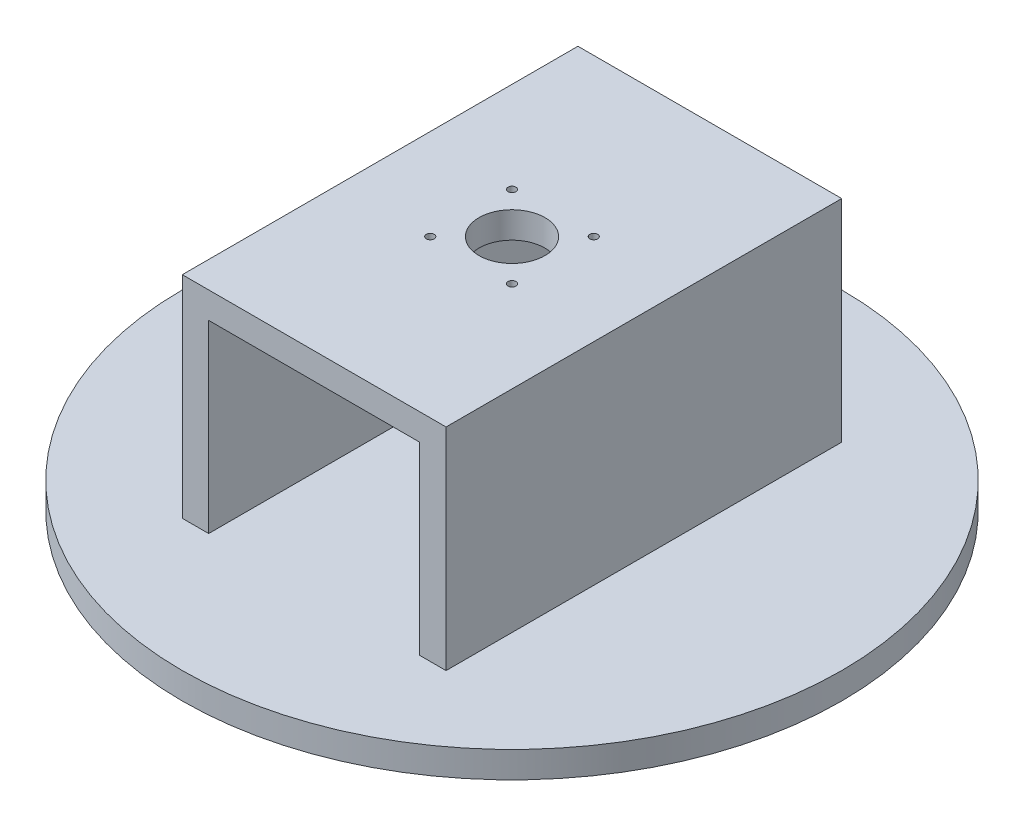
ISO-10303-21;
HEADER;
FILE_DESCRIPTION(('STEP AP214'),'2;1');
FILE_NAME('part.step','',(''),(''),'','','');
FILE_SCHEMA(('AUTOMOTIVE_DESIGN { 1 0 10303 214 1 1 1 1 }'));
ENDSEC;
DATA;
#1=APPLICATION_CONTEXT('core data for automotive mechanical design processes');
#2=APPLICATION_PROTOCOL_DEFINITION('international standard','automotive_design',2000,#1);
#3=PRODUCT_CONTEXT('',#1,'mechanical');
#4=PRODUCT('Part','Part','',(#3));
#5=PRODUCT_RELATED_PRODUCT_CATEGORY('part','',(#4));
#6=PRODUCT_DEFINITION_FORMATION('','',#4);
#7=PRODUCT_DEFINITION_CONTEXT('part definition',#1,'design');
#8=PRODUCT_DEFINITION('design','',#6,#7);
#9=PRODUCT_DEFINITION_SHAPE('','',#8);
#10=(LENGTH_UNIT() NAMED_UNIT(*) SI_UNIT(.MILLI.,.METRE.));
#11=(NAMED_UNIT(*) PLANE_ANGLE_UNIT() SI_UNIT($,.RADIAN.));
#12=(NAMED_UNIT(*) SI_UNIT($,.STERADIAN.) SOLID_ANGLE_UNIT());
#13=UNCERTAINTY_MEASURE_WITH_UNIT(LENGTH_MEASURE(1.E-05),#10,'distance_accuracy_value','');
#14=(GEOMETRIC_REPRESENTATION_CONTEXT(3) GLOBAL_UNCERTAINTY_ASSIGNED_CONTEXT((#13)) GLOBAL_UNIT_ASSIGNED_CONTEXT((#10,
#11,#12)) REPRESENTATION_CONTEXT('',''));
#15=CARTESIAN_POINT('',(0.,0.,0.));
#16=DIRECTION('',(0.,0.,1.));
#17=DIRECTION('',(1.,0.,0.));
#18=AXIS2_PLACEMENT_3D('',#15,#16,#17);
#19=CARTESIAN_POINT('',(0.,10.,0.));
#20=DIRECTION('',(0.,-1.,0.));
#21=DIRECTION('',(0.,0.,-1.));
#22=AXIS2_PLACEMENT_3D('',#19,#20,#21);
#23=CYLINDRICAL_SURFACE('',#22,125.);
#24=CARTESIAN_POINT('',(0.,10.,0.));
#25=DIRECTION('',(0.,1.,0.));
#26=DIRECTION('',(0.,0.,1.));
#27=AXIS2_PLACEMENT_3D('',#24,#25,#26);
#28=CIRCLE('',#27,125.);
#29=CARTESIAN_POINT('',(0.,10.,125.));
#30=VERTEX_POINT('',#29);
#31=EDGE_CURVE('E11',#30,#30,#28,.T.);
#32=ORIENTED_EDGE('',*,*,#31,.F.);
#33=EDGE_LOOP('',(#32));
#34=FACE_BOUND('',#33,.T.);
#35=CARTESIAN_POINT('',(0.,0.,0.));
#36=DIRECTION('',(0.,1.,0.));
#37=DIRECTION('',(0.,0.,1.));
#38=AXIS2_PLACEMENT_3D('',#35,#36,#37);
#39=CIRCLE('',#38,125.);
#40=CARTESIAN_POINT('',(0.,0.,125.));
#41=VERTEX_POINT('',#40);
#42=EDGE_CURVE('E41',#41,#41,#39,.T.);
#43=ORIENTED_EDGE('',*,*,#42,.T.);
#44=EDGE_LOOP('',(#43));
#45=FACE_BOUND('',#44,.T.);
#46=ADVANCED_FACE('F38',(#34,#45),#23,.T.);
#47=CARTESIAN_POINT('',(0.,10.,0.));
#48=DIRECTION('',(0.,1.,0.));
#49=DIRECTION('',(0.,0.,1.));
#50=AXIS2_PLACEMENT_3D('',#47,#48,#49);
#51=PLANE('',#50);
#52=DIRECTION('',(1.,0.,0.));
#53=VECTOR('',#52,1.);
#54=CARTESIAN_POINT('',(0.,10.,-75.));
#55=LINE('',#54,#53);
#56=CARTESIAN_POINT('',(40.,10.,-75.));
#57=VERTEX_POINT('',#56);
#58=CARTESIAN_POINT('',(50.,10.,-75.));
#59=VERTEX_POINT('',#58);
#60=EDGE_CURVE('E138',#57,#59,#55,.T.);
#61=ORIENTED_EDGE('',*,*,#60,.T.);
#62=DIRECTION('',(0.,0.,1.));
#63=VECTOR('',#62,1.);
#64=CARTESIAN_POINT('',(50.,10.,0.));
#65=LINE('',#64,#63);
#66=CARTESIAN_POINT('',(50.,10.,75.));
#67=VERTEX_POINT('',#66);
#68=EDGE_CURVE('E146',#59,#67,#65,.T.);
#69=ORIENTED_EDGE('',*,*,#68,.T.);
#70=DIRECTION('',(1.,0.,0.));
#71=VECTOR('',#70,1.);
#72=CARTESIAN_POINT('',(0.,10.,75.));
#73=LINE('',#72,#71);
#74=CARTESIAN_POINT('',(40.,10.,75.));
#75=VERTEX_POINT('',#74);
#76=EDGE_CURVE('E57',#75,#67,#73,.T.);
#77=ORIENTED_EDGE('',*,*,#76,.F.);
#78=DIRECTION('',(0.,0.,1.));
#79=VECTOR('',#78,1.);
#80=CARTESIAN_POINT('',(40.,10.,0.));
#81=LINE('',#80,#79);
#82=EDGE_CURVE('E52',#57,#75,#81,.T.);
#83=ORIENTED_EDGE('',*,*,#82,.F.);
#84=EDGE_LOOP('',(#61,#69,#77,#83));
#85=FACE_BOUND('',#84,.T.);
#86=DIRECTION('',(0.,0.,1.));
#87=VECTOR('',#86,1.);
#88=CARTESIAN_POINT('',(-40.,10.,0.));
#89=LINE('',#88,#87);
#90=CARTESIAN_POINT('',(-40.,10.,-75.));
#91=VERTEX_POINT('',#90);
#92=CARTESIAN_POINT('',(-40.,10.,75.));
#93=VERTEX_POINT('',#92);
#94=EDGE_CURVE('E159',#91,#93,#89,.T.);
#95=ORIENTED_EDGE('',*,*,#94,.T.);
#96=DIRECTION('',(1.,0.,0.));
#97=VECTOR('',#96,1.);
#98=CARTESIAN_POINT('',(0.,10.,75.));
#99=LINE('',#98,#97);
#100=CARTESIAN_POINT('',(-50.,10.,75.));
#101=VERTEX_POINT('',#100);
#102=EDGE_CURVE('E163',#101,#93,#99,.T.);
#103=ORIENTED_EDGE('',*,*,#102,.F.);
#104=DIRECTION('',(0.,0.,1.));
#105=VECTOR('',#104,1.);
#106=CARTESIAN_POINT('',(-50.,10.,0.));
#107=LINE('',#106,#105);
#108=CARTESIAN_POINT('',(-50.,10.,-75.));
#109=VERTEX_POINT('',#108);
#110=EDGE_CURVE('E106',#109,#101,#107,.T.);
#111=ORIENTED_EDGE('',*,*,#110,.F.);
#112=DIRECTION('',(1.,0.,0.));
#113=VECTOR('',#112,1.);
#114=CARTESIAN_POINT('',(0.,10.,-75.));
#115=LINE('',#114,#113);
#116=EDGE_CURVE('E166',#109,#91,#115,.T.);
#117=ORIENTED_EDGE('',*,*,#116,.T.);
#118=EDGE_LOOP('',(#95,#103,#111,#117));
#119=FACE_BOUND('',#118,.T.);
#120=ORIENTED_EDGE('',*,*,#31,.T.);
#121=EDGE_LOOP('',(#120));
#122=FACE_BOUND('',#121,.T.);
#123=ADVANCED_FACE('F185',(#85,#119,#122),#51,.T.);
#124=CARTESIAN_POINT('',(0.,0.,0.));
#125=DIRECTION('',(0.,1.,0.));
#126=DIRECTION('',(0.,0.,1.));
#127=AXIS2_PLACEMENT_3D('',#124,#125,#126);
#128=PLANE('',#127);
#129=ORIENTED_EDGE('',*,*,#42,.F.);
#130=EDGE_LOOP('',(#129));
#131=FACE_BOUND('',#130,.T.);
#132=ADVANCED_FACE('F182',(#131),#128,.F.);
#133=CARTESIAN_POINT('',(-40.,80.,0.));
#134=DIRECTION('',(1.,0.,0.));
#135=DIRECTION('',(0.,0.,-1.));
#136=AXIS2_PLACEMENT_3D('',#133,#134,#135);
#137=PLANE('',#136);
#138=ORIENTED_EDGE('',*,*,#94,.F.);
#139=DIRECTION('',(0.,-1.,0.));
#140=VECTOR('',#139,1.);
#141=CARTESIAN_POINT('',(-40.,80.,-75.));
#142=LINE('',#141,#140);
#143=CARTESIAN_POINT('',(-40.,80.,-75.));
#144=VERTEX_POINT('',#143);
#145=EDGE_CURVE('E173',#144,#91,#142,.T.);
#146=ORIENTED_EDGE('',*,*,#145,.F.);
#147=DIRECTION('',(0.,0.,1.));
#148=VECTOR('',#147,1.);
#149=CARTESIAN_POINT('',(-40.,80.,0.));
#150=LINE('',#149,#148);
#151=CARTESIAN_POINT('',(-40.,80.,75.));
#152=VERTEX_POINT('',#151);
#153=EDGE_CURVE('E160',#144,#152,#150,.T.);
#154=ORIENTED_EDGE('',*,*,#153,.T.);
#155=DIRECTION('',(0.,-1.,0.));
#156=VECTOR('',#155,1.);
#157=CARTESIAN_POINT('',(-40.,80.,75.));
#158=LINE('',#157,#156);
#159=EDGE_CURVE('E111',#152,#93,#158,.T.);
#160=ORIENTED_EDGE('',*,*,#159,.T.);
#161=EDGE_LOOP('',(#138,#146,#154,#160));
#162=FACE_BOUND('',#161,.T.);
#163=ADVANCED_FACE('F184',(#162),#137,.T.);
#164=CARTESIAN_POINT('',(0.,80.,-75.));
#165=DIRECTION('',(0.,0.,-1.));
#166=DIRECTION('',(-1.,0.,0.));
#167=AXIS2_PLACEMENT_3D('',#164,#165,#166);
#168=PLANE('',#167);
#169=ORIENTED_EDGE('',*,*,#116,.F.);
#170=DIRECTION('',(0.,-1.,0.));
#171=VECTOR('',#170,1.);
#172=CARTESIAN_POINT('',(-50.,80.,-75.));
#173=LINE('',#172,#171);
#174=CARTESIAN_POINT('',(-50.,90.,-75.));
#175=VERTEX_POINT('',#174);
#176=EDGE_CURVE('E110',#175,#109,#173,.T.);
#177=ORIENTED_EDGE('',*,*,#176,.F.);
#178=DIRECTION('',(-1.,0.,0.));
#179=VECTOR('',#178,1.);
#180=CARTESIAN_POINT('',(-50.,90.,-75.));
#181=LINE('',#180,#179);
#182=CARTESIAN_POINT('',(50.,90.,-75.));
#183=VERTEX_POINT('',#182);
#184=EDGE_CURVE('E126',#183,#175,#181,.T.);
#185=ORIENTED_EDGE('',*,*,#184,.F.);
#186=DIRECTION('',(0.,-1.,0.));
#187=VECTOR('',#186,1.);
#188=CARTESIAN_POINT('',(50.,80.,-75.));
#189=LINE('',#188,#187);
#190=EDGE_CURVE('E145',#183,#59,#189,.T.);
#191=ORIENTED_EDGE('',*,*,#190,.T.);
#192=ORIENTED_EDGE('',*,*,#60,.F.);
#193=DIRECTION('',(0.,-1.,0.));
#194=VECTOR('',#193,1.);
#195=CARTESIAN_POINT('',(40.,80.,-75.));
#196=LINE('',#195,#194);
#197=CARTESIAN_POINT('',(40.,80.,-75.));
#198=VERTEX_POINT('',#197);
#199=EDGE_CURVE('E157',#198,#57,#196,.T.);
#200=ORIENTED_EDGE('',*,*,#199,.F.);
#201=DIRECTION('',(-1.,0.,0.));
#202=VECTOR('',#201,1.);
#203=CARTESIAN_POINT('',(-50.,80.,-75.));
#204=LINE('',#203,#202);
#205=EDGE_CURVE('E127',#198,#144,#204,.T.);
#206=ORIENTED_EDGE('',*,*,#205,.T.);
#207=ORIENTED_EDGE('',*,*,#145,.T.);
#208=EDGE_LOOP('',(#169,#177,#185,#191,#192,#200,#206,#207));
#209=FACE_BOUND('',#208,.T.);
#210=ADVANCED_FACE('F190',(#209),#168,.T.);
#211=CARTESIAN_POINT('',(-50.,80.,0.));
#212=DIRECTION('',(1.,0.,0.));
#213=DIRECTION('',(0.,0.,-1.));
#214=AXIS2_PLACEMENT_3D('',#211,#212,#213);
#215=PLANE('',#214);
#216=ORIENTED_EDGE('',*,*,#110,.T.);
#217=DIRECTION('',(0.,-1.,0.));
#218=VECTOR('',#217,1.);
#219=CARTESIAN_POINT('',(-50.,80.,75.));
#220=LINE('',#219,#218);
#221=CARTESIAN_POINT('',(-50.,90.,75.));
#222=VERTEX_POINT('',#221);
#223=EDGE_CURVE('E100',#222,#101,#220,.T.);
#224=ORIENTED_EDGE('',*,*,#223,.F.);
#225=DIRECTION('',(0.,0.,1.));
#226=VECTOR('',#225,1.);
#227=CARTESIAN_POINT('',(-50.,90.,-75.));
#228=LINE('',#227,#226);
#229=EDGE_CURVE('E104',#175,#222,#228,.T.);
#230=ORIENTED_EDGE('',*,*,#229,.F.);
#231=ORIENTED_EDGE('',*,*,#176,.T.);
#232=EDGE_LOOP('',(#216,#224,#230,#231));
#233=FACE_BOUND('',#232,.T.);
#234=ADVANCED_FACE('F102',(#233),#215,.F.);
#235=CARTESIAN_POINT('',(0.,80.,75.));
#236=DIRECTION('',(0.,0.,-1.));
#237=DIRECTION('',(-1.,0.,0.));
#238=AXIS2_PLACEMENT_3D('',#235,#236,#237);
#239=PLANE('',#238);
#240=ORIENTED_EDGE('',*,*,#102,.T.);
#241=ORIENTED_EDGE('',*,*,#159,.F.);
#242=DIRECTION('',(1.,0.,0.));
#243=VECTOR('',#242,1.);
#244=CARTESIAN_POINT('',(-50.,80.,75.));
#245=LINE('',#244,#243);
#246=CARTESIAN_POINT('',(40.,80.,75.));
#247=VERTEX_POINT('',#246);
#248=EDGE_CURVE('E130',#152,#247,#245,.T.);
#249=ORIENTED_EDGE('',*,*,#248,.T.);
#250=DIRECTION('',(0.,-1.,0.));
#251=VECTOR('',#250,1.);
#252=CARTESIAN_POINT('',(40.,80.,75.));
#253=LINE('',#252,#251);
#254=EDGE_CURVE('E154',#247,#75,#253,.T.);
#255=ORIENTED_EDGE('',*,*,#254,.T.);
#256=ORIENTED_EDGE('',*,*,#76,.T.);
#257=DIRECTION('',(0.,-1.,0.));
#258=VECTOR('',#257,1.);
#259=CARTESIAN_POINT('',(50.,80.,75.));
#260=LINE('',#259,#258);
#261=CARTESIAN_POINT('',(50.,90.,75.));
#262=VERTEX_POINT('',#261);
#263=EDGE_CURVE('E117',#262,#67,#260,.T.);
#264=ORIENTED_EDGE('',*,*,#263,.F.);
#265=DIRECTION('',(1.,0.,0.));
#266=VECTOR('',#265,1.);
#267=CARTESIAN_POINT('',(-50.,90.,75.));
#268=LINE('',#267,#266);
#269=EDGE_CURVE('E114',#222,#262,#268,.T.);
#270=ORIENTED_EDGE('',*,*,#269,.F.);
#271=ORIENTED_EDGE('',*,*,#223,.T.);
#272=EDGE_LOOP('',(#240,#241,#249,#255,#256,#264,#270,#271));
#273=FACE_BOUND('',#272,.T.);
#274=ADVANCED_FACE('F115',(#273),#239,.F.);
#275=CARTESIAN_POINT('',(40.,80.,0.));
#276=DIRECTION('',(1.,0.,0.));
#277=DIRECTION('',(0.,0.,-1.));
#278=AXIS2_PLACEMENT_3D('',#275,#276,#277);
#279=PLANE('',#278);
#280=ORIENTED_EDGE('',*,*,#82,.T.);
#281=ORIENTED_EDGE('',*,*,#254,.F.);
#282=DIRECTION('',(0.,0.,1.));
#283=VECTOR('',#282,1.);
#284=CARTESIAN_POINT('',(40.,80.,0.));
#285=LINE('',#284,#283);
#286=EDGE_CURVE('E142',#198,#247,#285,.T.);
#287=ORIENTED_EDGE('',*,*,#286,.F.);
#288=ORIENTED_EDGE('',*,*,#199,.T.);
#289=EDGE_LOOP('',(#280,#281,#287,#288));
#290=FACE_BOUND('',#289,.T.);
#291=ADVANCED_FACE('F215',(#290),#279,.F.);
#292=CARTESIAN_POINT('',(50.,80.,0.));
#293=DIRECTION('',(1.,0.,0.));
#294=DIRECTION('',(0.,0.,-1.));
#295=AXIS2_PLACEMENT_3D('',#292,#293,#294);
#296=PLANE('',#295);
#297=ORIENTED_EDGE('',*,*,#68,.F.);
#298=ORIENTED_EDGE('',*,*,#190,.F.);
#299=DIRECTION('',(0.,0.,-1.));
#300=VECTOR('',#299,1.);
#301=CARTESIAN_POINT('',(50.,90.,-75.));
#302=LINE('',#301,#300);
#303=EDGE_CURVE('E121',#262,#183,#302,.T.);
#304=ORIENTED_EDGE('',*,*,#303,.F.);
#305=ORIENTED_EDGE('',*,*,#263,.T.);
#306=EDGE_LOOP('',(#297,#298,#304,#305));
#307=FACE_BOUND('',#306,.T.);
#308=ADVANCED_FACE('F239',(#307),#296,.T.);
#309=CARTESIAN_POINT('',(0.,80.,0.));
#310=DIRECTION('',(0.,1.,0.));
#311=DIRECTION('',(0.,0.,1.));
#312=AXIS2_PLACEMENT_3D('',#309,#310,#311);
#313=PLANE('',#312);
#314=CARTESIAN_POINT('',(15.5,80.,-15.5));
#315=DIRECTION('',(0.,1.,0.));
#316=DIRECTION('',(0.,0.,1.));
#317=AXIS2_PLACEMENT_3D('',#314,#315,#316);
#318=CIRCLE('',#317,1.5);
#319=CARTESIAN_POINT('',(15.5,80.,-14.));
#320=VERTEX_POINT('',#319);
#321=EDGE_CURVE('E379',#320,#320,#318,.T.);
#322=ORIENTED_EDGE('',*,*,#321,.T.);
#323=EDGE_LOOP('',(#322));
#324=FACE_BOUND('',#323,.T.);
#325=CARTESIAN_POINT('',(-15.5,80.,15.5));
#326=DIRECTION('',(0.,1.,0.));
#327=DIRECTION('',(0.,0.,1.));
#328=AXIS2_PLACEMENT_3D('',#325,#326,#327);
#329=CIRCLE('',#328,1.5);
#330=CARTESIAN_POINT('',(-15.5,80.,17.));
#331=VERTEX_POINT('',#330);
#332=EDGE_CURVE('E383',#331,#331,#329,.T.);
#333=ORIENTED_EDGE('',*,*,#332,.T.);
#334=EDGE_LOOP('',(#333));
#335=FACE_BOUND('',#334,.T.);
#336=CARTESIAN_POINT('',(15.5,80.,15.5));
#337=DIRECTION('',(0.,1.,0.));
#338=DIRECTION('',(0.,0.,1.));
#339=AXIS2_PLACEMENT_3D('',#336,#337,#338);
#340=CIRCLE('',#339,1.5);
#341=CARTESIAN_POINT('',(15.5,80.,17.));
#342=VERTEX_POINT('',#341);
#343=EDGE_CURVE('E392',#342,#342,#340,.T.);
#344=ORIENTED_EDGE('',*,*,#343,.T.);
#345=EDGE_LOOP('',(#344));
#346=FACE_BOUND('',#345,.T.);
#347=CARTESIAN_POINT('',(0.,80.,0.));
#348=DIRECTION('',(0.,1.,0.));
#349=DIRECTION('',(0.,0.,1.));
#350=AXIS2_PLACEMENT_3D('',#347,#348,#349);
#351=CIRCLE('',#350,12.5);
#352=CARTESIAN_POINT('',(0.,80.,12.5));
#353=VERTEX_POINT('',#352);
#354=EDGE_CURVE('E408',#353,#353,#351,.T.);
#355=ORIENTED_EDGE('',*,*,#354,.T.);
#356=EDGE_LOOP('',(#355));
#357=FACE_BOUND('',#356,.T.);
#358=CARTESIAN_POINT('',(-15.5,80.,-15.5));
#359=DIRECTION('',(0.,1.,0.));
#360=DIRECTION('',(0.,0.,1.));
#361=AXIS2_PLACEMENT_3D('',#358,#359,#360);
#362=CIRCLE('',#361,1.5);
#363=CARTESIAN_POINT('',(-15.5,80.,-14.));
#364=VERTEX_POINT('',#363);
#365=EDGE_CURVE('E140',#364,#364,#362,.T.);
#366=ORIENTED_EDGE('',*,*,#365,.T.);
#367=EDGE_LOOP('',(#366));
#368=FACE_BOUND('',#367,.T.);
#369=ORIENTED_EDGE('',*,*,#153,.F.);
#370=ORIENTED_EDGE('',*,*,#205,.F.);
#371=ORIENTED_EDGE('',*,*,#286,.T.);
#372=ORIENTED_EDGE('',*,*,#248,.F.);
#373=EDGE_LOOP('',(#369,#370,#371,#372));
#374=FACE_BOUND('',#373,.T.);
#375=ADVANCED_FACE('F229',(#324,#335,#346,#357,#368,#374),#313,.F.);
#376=CARTESIAN_POINT('',(0.,90.,0.));
#377=DIRECTION('',(0.,1.,0.));
#378=DIRECTION('',(0.,0.,1.));
#379=AXIS2_PLACEMENT_3D('',#376,#377,#378);
#380=PLANE('',#379);
#381=CARTESIAN_POINT('',(15.5,90.,-15.5));
#382=DIRECTION('',(0.,1.,0.));
#383=DIRECTION('',(0.,0.,1.));
#384=AXIS2_PLACEMENT_3D('',#381,#382,#383);
#385=CIRCLE('',#384,1.5);
#386=CARTESIAN_POINT('',(15.5,90.,-14.));
#387=VERTEX_POINT('',#386);
#388=EDGE_CURVE('E382',#387,#387,#385,.T.);
#389=ORIENTED_EDGE('',*,*,#388,.F.);
#390=EDGE_LOOP('',(#389));
#391=FACE_BOUND('',#390,.T.);
#392=CARTESIAN_POINT('',(-15.5,90.,15.5));
#393=DIRECTION('',(0.,1.,0.));
#394=DIRECTION('',(0.,0.,1.));
#395=AXIS2_PLACEMENT_3D('',#392,#393,#394);
#396=CIRCLE('',#395,1.5);
#397=CARTESIAN_POINT('',(-15.5,90.,17.));
#398=VERTEX_POINT('',#397);
#399=EDGE_CURVE('E387',#398,#398,#396,.T.);
#400=ORIENTED_EDGE('',*,*,#399,.F.);
#401=EDGE_LOOP('',(#400));
#402=FACE_BOUND('',#401,.T.);
#403=CARTESIAN_POINT('',(15.5,90.,15.5));
#404=DIRECTION('',(0.,1.,0.));
#405=DIRECTION('',(0.,0.,1.));
#406=AXIS2_PLACEMENT_3D('',#403,#404,#405);
#407=CIRCLE('',#406,1.5);
#408=CARTESIAN_POINT('',(15.5,90.,17.));
#409=VERTEX_POINT('',#408);
#410=EDGE_CURVE('E403',#409,#409,#407,.T.);
#411=ORIENTED_EDGE('',*,*,#410,.F.);
#412=EDGE_LOOP('',(#411));
#413=FACE_BOUND('',#412,.T.);
#414=CARTESIAN_POINT('',(0.,90.,0.));
#415=DIRECTION('',(0.,1.,0.));
#416=DIRECTION('',(0.,0.,1.));
#417=AXIS2_PLACEMENT_3D('',#414,#415,#416);
#418=CIRCLE('',#417,12.5);
#419=CARTESIAN_POINT('',(0.,90.,12.5));
#420=VERTEX_POINT('',#419);
#421=EDGE_CURVE('E412',#420,#420,#418,.T.);
#422=ORIENTED_EDGE('',*,*,#421,.F.);
#423=EDGE_LOOP('',(#422));
#424=FACE_BOUND('',#423,.T.);
#425=CARTESIAN_POINT('',(-15.5,90.,-15.5));
#426=DIRECTION('',(0.,1.,0.));
#427=DIRECTION('',(0.,0.,1.));
#428=AXIS2_PLACEMENT_3D('',#425,#426,#427);
#429=CIRCLE('',#428,1.5);
#430=CARTESIAN_POINT('',(-15.5,90.,-14.));
#431=VERTEX_POINT('',#430);
#432=EDGE_CURVE('E133',#431,#431,#429,.T.);
#433=ORIENTED_EDGE('',*,*,#432,.F.);
#434=EDGE_LOOP('',(#433));
#435=FACE_BOUND('',#434,.T.);
#436=ORIENTED_EDGE('',*,*,#229,.T.);
#437=ORIENTED_EDGE('',*,*,#269,.T.);
#438=ORIENTED_EDGE('',*,*,#303,.T.);
#439=ORIENTED_EDGE('',*,*,#184,.T.);
#440=EDGE_LOOP('',(#436,#437,#438,#439));
#441=FACE_BOUND('',#440,.T.);
#442=ADVANCED_FACE('F124',(#391,#402,#413,#424,#435,#441),#380,.T.);
#443=CARTESIAN_POINT('',(-15.5,80.,-15.5));
#444=DIRECTION('',(0.,1.,0.));
#445=DIRECTION('',(0.,0.,1.));
#446=AXIS2_PLACEMENT_3D('',#443,#444,#445);
#447=CYLINDRICAL_SURFACE('',#446,1.5);
#448=ORIENTED_EDGE('',*,*,#365,.F.);
#449=EDGE_LOOP('',(#448));
#450=FACE_BOUND('',#449,.T.);
#451=ORIENTED_EDGE('',*,*,#432,.T.);
#452=EDGE_LOOP('',(#451));
#453=FACE_BOUND('',#452,.T.);
#454=ADVANCED_FACE('F228',(#450,#453),#447,.F.);
#455=CARTESIAN_POINT('',(0.,80.,0.));
#456=DIRECTION('',(0.,1.,0.));
#457=DIRECTION('',(0.,0.,1.));
#458=AXIS2_PLACEMENT_3D('',#455,#456,#457);
#459=CYLINDRICAL_SURFACE('',#458,12.5);
#460=ORIENTED_EDGE('',*,*,#354,.F.);
#461=EDGE_LOOP('',(#460));
#462=FACE_BOUND('',#461,.T.);
#463=ORIENTED_EDGE('',*,*,#421,.T.);
#464=EDGE_LOOP('',(#463));
#465=FACE_BOUND('',#464,.T.);
#466=ADVANCED_FACE('F266',(#462,#465),#459,.F.);
#467=CARTESIAN_POINT('',(15.5,80.,15.5));
#468=DIRECTION('',(0.,1.,0.));
#469=DIRECTION('',(0.,0.,1.));
#470=AXIS2_PLACEMENT_3D('',#467,#468,#469);
#471=CYLINDRICAL_SURFACE('',#470,1.5);
#472=ORIENTED_EDGE('',*,*,#343,.F.);
#473=EDGE_LOOP('',(#472));
#474=FACE_BOUND('',#473,.T.);
#475=ORIENTED_EDGE('',*,*,#410,.T.);
#476=EDGE_LOOP('',(#475));
#477=FACE_BOUND('',#476,.T.);
#478=ADVANCED_FACE('F275',(#474,#477),#471,.F.);
#479=CARTESIAN_POINT('',(-15.5,80.,15.5));
#480=DIRECTION('',(0.,1.,0.));
#481=DIRECTION('',(0.,0.,1.));
#482=AXIS2_PLACEMENT_3D('',#479,#480,#481);
#483=CYLINDRICAL_SURFACE('',#482,1.5);
#484=ORIENTED_EDGE('',*,*,#332,.F.);
#485=EDGE_LOOP('',(#484));
#486=FACE_BOUND('',#485,.T.);
#487=ORIENTED_EDGE('',*,*,#399,.T.);
#488=EDGE_LOOP('',(#487));
#489=FACE_BOUND('',#488,.T.);
#490=ADVANCED_FACE('F284',(#486,#489),#483,.F.);
#491=CARTESIAN_POINT('',(15.5,80.,-15.5));
#492=DIRECTION('',(0.,1.,0.));
#493=DIRECTION('',(0.,0.,1.));
#494=AXIS2_PLACEMENT_3D('',#491,#492,#493);
#495=CYLINDRICAL_SURFACE('',#494,1.5);
#496=ORIENTED_EDGE('',*,*,#321,.F.);
#497=EDGE_LOOP('',(#496));
#498=FACE_BOUND('',#497,.T.);
#499=ORIENTED_EDGE('',*,*,#388,.T.);
#500=EDGE_LOOP('',(#499));
#501=FACE_BOUND('',#500,.T.);
#502=ADVANCED_FACE('F293',(#498,#501),#495,.F.);
#503=CLOSED_SHELL('',(#46,#123,#132,#163,#210,#234,#274,#291,#308,#375,#442,#454,#466,#478,#490,#502));
#504=MANIFOLD_SOLID_BREP('B2',#503);
#505=ADVANCED_BREP_SHAPE_REPRESENTATION('',(#18,#504),#14);
#506=SHAPE_DEFINITION_REPRESENTATION(#9,#505);
ENDSEC;
END-ISO-10303-21;
